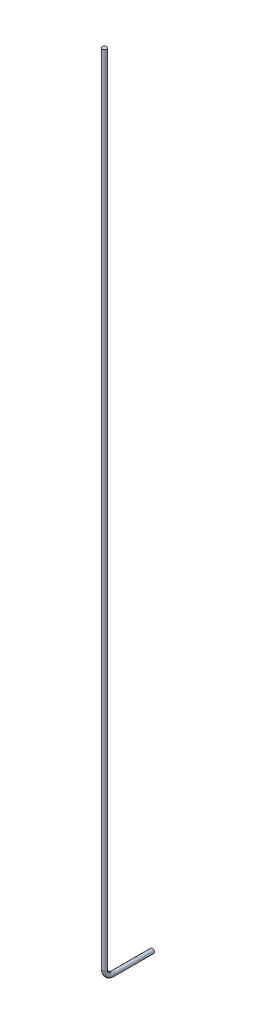
ISO-10303-21;
HEADER;
FILE_DESCRIPTION(('STEP AP214'),'2;1');
FILE_NAME('part.step','',(''),(''),'','','');
FILE_SCHEMA(('AUTOMOTIVE_DESIGN { 1 0 10303 214 1 1 1 1 }'));
ENDSEC;
DATA;
#1=APPLICATION_CONTEXT('core data for automotive mechanical design processes');
#2=APPLICATION_PROTOCOL_DEFINITION('international standard','automotive_design',2000,#1);
#3=PRODUCT_CONTEXT('',#1,'mechanical');
#4=PRODUCT('Part','Part','',(#3));
#5=PRODUCT_RELATED_PRODUCT_CATEGORY('part','',(#4));
#6=PRODUCT_DEFINITION_FORMATION('','',#4);
#7=PRODUCT_DEFINITION_CONTEXT('part definition',#1,'design');
#8=PRODUCT_DEFINITION('design','',#6,#7);
#9=PRODUCT_DEFINITION_SHAPE('','',#8);
#10=(LENGTH_UNIT() NAMED_UNIT(*) SI_UNIT(.MILLI.,.METRE.));
#11=(NAMED_UNIT(*) PLANE_ANGLE_UNIT() SI_UNIT($,.RADIAN.));
#12=(NAMED_UNIT(*) SI_UNIT($,.STERADIAN.) SOLID_ANGLE_UNIT());
#13=UNCERTAINTY_MEASURE_WITH_UNIT(LENGTH_MEASURE(1.E-05),#10,'distance_accuracy_value','');
#14=(GEOMETRIC_REPRESENTATION_CONTEXT(3) GLOBAL_UNCERTAINTY_ASSIGNED_CONTEXT((#13)) GLOBAL_UNIT_ASSIGNED_CONTEXT((#10,
#11,#12)) REPRESENTATION_CONTEXT('',''));
#15=CARTESIAN_POINT('',(0.,0.,0.));
#16=DIRECTION('',(0.,0.,1.));
#17=DIRECTION('',(1.,0.,0.));
#18=AXIS2_PLACEMENT_3D('',#15,#16,#17);
#19=CARTESIAN_POINT('',(0.,0.,20.));
#20=DIRECTION('',(0.,0.,-1.));
#21=DIRECTION('',(-1.,0.,0.));
#22=AXIS2_PLACEMENT_3D('',#19,#20,#21);
#23=CYLINDRICAL_SURFACE('',#22,1.39);
#24=CARTESIAN_POINT('',(0.,0.,0.));
#25=DIRECTION('',(0.,0.,1.));
#26=DIRECTION('',(1.,0.,0.));
#27=AXIS2_PLACEMENT_3D('',#24,#25,#26);
#28=CIRCLE('',#27,1.39);
#29=CARTESIAN_POINT('',(1.39,0.,0.));
#30=VERTEX_POINT('',#29);
#31=EDGE_CURVE('E10',#30,#30,#28,.T.);
#32=ORIENTED_EDGE('',*,*,#31,.T.);
#33=EDGE_LOOP('',(#32));
#34=FACE_BOUND('',#33,.T.);
#35=CARTESIAN_POINT('',(0.,0.,25.));
#36=DIRECTION('',(0.,0.,1.));
#37=DIRECTION('',(1.,0.,0.));
#38=AXIS2_PLACEMENT_3D('',#35,#36,#37);
#39=CIRCLE('',#38,1.39);
#40=CARTESIAN_POINT('',(0.,-1.38999999999984,25.));
#41=VERTEX_POINT('',#40);
#42=EDGE_CURVE('E56',#41,#41,#39,.T.);
#43=ORIENTED_EDGE('',*,*,#42,.F.);
#44=EDGE_LOOP('',(#43));
#45=FACE_BOUND('',#44,.T.);
#46=ADVANCED_FACE('F39',(#34,#45),#23,.T.);
#47=CARTESIAN_POINT('',(0.,0.,0.));
#48=DIRECTION('',(0.,0.,1.));
#49=DIRECTION('',(1.,0.,0.));
#50=AXIS2_PLACEMENT_3D('',#47,#48,#49);
#51=PLANE('',#50);
#52=ORIENTED_EDGE('',*,*,#31,.F.);
#53=EDGE_LOOP('',(#52));
#54=FACE_BOUND('',#53,.T.);
#55=ADVANCED_FACE('F66',(#54),#51,.F.);
#56=CARTESIAN_POINT('',(0.,505.,30.));
#57=DIRECTION('',(0.,1.,0.));
#58=DIRECTION('',(1.,0.,0.));
#59=AXIS2_PLACEMENT_3D('',#56,#57,#58);
#60=PLANE('',#59);
#61=CARTESIAN_POINT('',(0.,505.,30.));
#62=DIRECTION('',(0.,1.,0.));
#63=DIRECTION('',(1.,0.,0.));
#64=AXIS2_PLACEMENT_3D('',#61,#62,#63);
#65=CIRCLE('',#64,1.39);
#66=CARTESIAN_POINT('',(1.39,505.,30.));
#67=VERTEX_POINT('',#66);
#68=EDGE_CURVE('E46',#67,#67,#65,.T.);
#69=ORIENTED_EDGE('',*,*,#68,.T.);
#70=EDGE_LOOP('',(#69));
#71=FACE_BOUND('',#70,.T.);
#72=ADVANCED_FACE('F70',(#71),#60,.T.);
#73=CARTESIAN_POINT('',(0.,5.,25.));
#74=DIRECTION('',(-1.,0.,0.));
#75=DIRECTION('',(0.,0.,1.));
#76=AXIS2_PLACEMENT_3D('',#73,#74,#75);
#77=TOROIDAL_SURFACE('',#76,4.99999999999984,1.39);
#78=CARTESIAN_POINT('',(0.,5.,30.));
#79=DIRECTION('',(0.,1.,0.));
#80=DIRECTION('',(1.,0.,0.));
#81=AXIS2_PLACEMENT_3D('',#78,#79,#80);
#82=CIRCLE('',#81,1.39);
#83=CARTESIAN_POINT('',(0.,5.,31.3899999999998));
#84=VERTEX_POINT('',#83);
#85=EDGE_CURVE('E51',#84,#84,#82,.T.);
#86=CARTESIAN_POINT('',(0.,5.,25.));
#87=DIRECTION('',(-1.,0.,0.));
#88=DIRECTION('',(0.,0.,1.));
#89=AXIS2_PLACEMENT_3D('',#86,#87,#88);
#90=CIRCLE('',#89,6.38999999999984);
#91=EDGE_CURVE('',#41,#84,#90,.T.);
#92=ORIENTED_EDGE('',*,*,#42,.T.);
#93=ORIENTED_EDGE('',*,*,#85,.F.);
#94=ORIENTED_EDGE('',*,*,#91,.T.);
#95=ORIENTED_EDGE('',*,*,#91,.F.);
#96=EDGE_LOOP('',(#92,#94,#93,#95));
#97=FACE_BOUND('',#96,.T.);
#98=ADVANCED_FACE('F63',(#97),#77,.T.);
#99=CARTESIAN_POINT('',(0.,5.,30.));
#100=DIRECTION('',(0.,1.,0.));
#101=DIRECTION('',(0.,0.,1.));
#102=AXIS2_PLACEMENT_3D('',#99,#100,#101);
#103=CYLINDRICAL_SURFACE('',#102,1.39);
#104=ORIENTED_EDGE('',*,*,#68,.F.);
#105=EDGE_LOOP('',(#104));
#106=FACE_BOUND('',#105,.T.);
#107=ORIENTED_EDGE('',*,*,#85,.T.);
#108=EDGE_LOOP('',(#107));
#109=FACE_BOUND('',#108,.T.);
#110=ADVANCED_FACE('F72',(#106,#109),#103,.T.);
#111=CLOSED_SHELL('',(#46,#55,#72,#98,#110));
#112=MANIFOLD_SOLID_BREP('B2',#111);
#113=ADVANCED_BREP_SHAPE_REPRESENTATION('',(#18,#112),#14);
#114=SHAPE_DEFINITION_REPRESENTATION(#9,#113);
ENDSEC;
END-ISO-10303-21;
